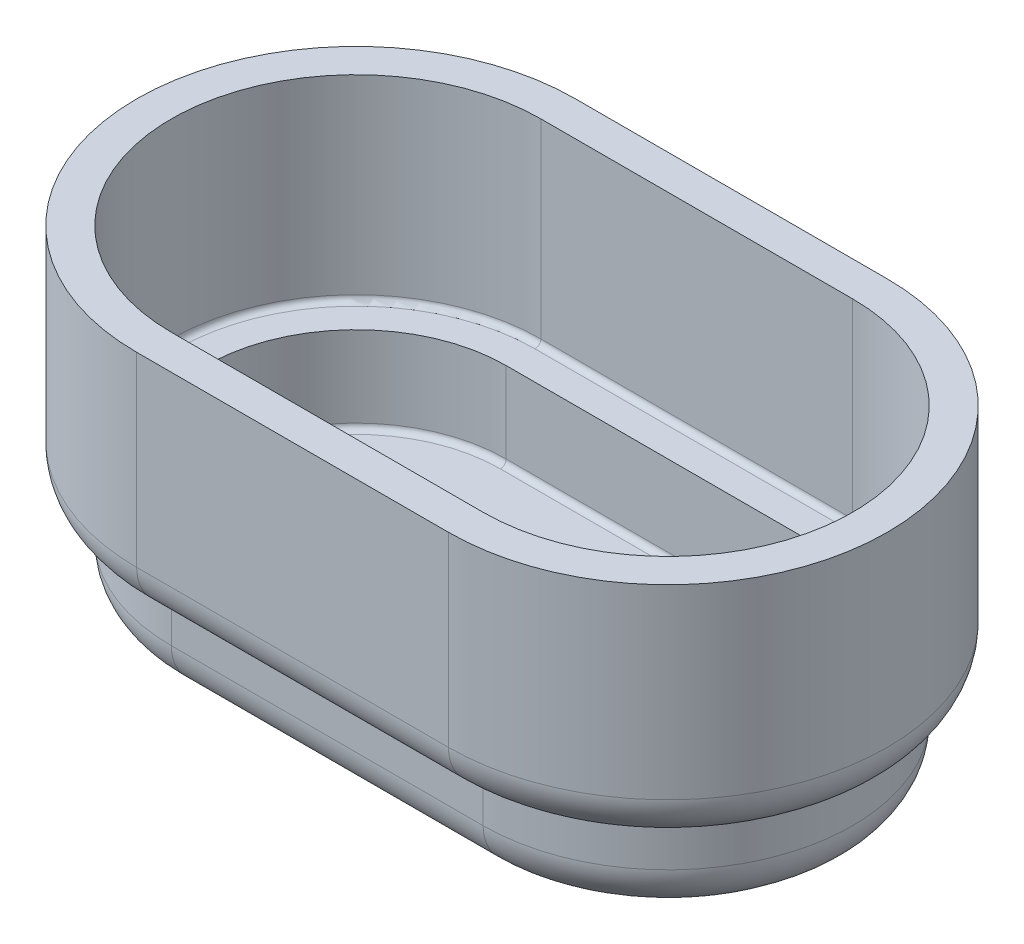
ISO-10303-21;
HEADER;
FILE_DESCRIPTION(('STEP AP214'),'2;1');
FILE_NAME('part.step','',(''),(''),'','','');
FILE_SCHEMA(('AUTOMOTIVE_DESIGN { 1 0 10303 214 1 1 1 1 }'));
ENDSEC;
DATA;
#1=APPLICATION_CONTEXT('core data for automotive mechanical design processes');
#2=APPLICATION_PROTOCOL_DEFINITION('international standard','automotive_design',2000,#1);
#3=PRODUCT_CONTEXT('',#1,'mechanical');
#4=PRODUCT('Part','Part','',(#3));
#5=PRODUCT_RELATED_PRODUCT_CATEGORY('part','',(#4));
#6=PRODUCT_DEFINITION_FORMATION('','',#4);
#7=PRODUCT_DEFINITION_CONTEXT('part definition',#1,'design');
#8=PRODUCT_DEFINITION('design','',#6,#7);
#9=PRODUCT_DEFINITION_SHAPE('','',#8);
#10=(LENGTH_UNIT() NAMED_UNIT(*) SI_UNIT(.MILLI.,.METRE.));
#11=(NAMED_UNIT(*) PLANE_ANGLE_UNIT() SI_UNIT($,.RADIAN.));
#12=(NAMED_UNIT(*) SI_UNIT($,.STERADIAN.) SOLID_ANGLE_UNIT());
#13=UNCERTAINTY_MEASURE_WITH_UNIT(LENGTH_MEASURE(1.E-05),#10,'distance_accuracy_value','');
#14=(GEOMETRIC_REPRESENTATION_CONTEXT(3) GLOBAL_UNCERTAINTY_ASSIGNED_CONTEXT((#13)) GLOBAL_UNIT_ASSIGNED_CONTEXT((#10,
#11,#12)) REPRESENTATION_CONTEXT('',''));
#15=CARTESIAN_POINT('',(0.,0.,0.));
#16=DIRECTION('',(0.,0.,1.));
#17=DIRECTION('',(1.,0.,0.));
#18=AXIS2_PLACEMENT_3D('',#15,#16,#17);
#19=CARTESIAN_POINT('',(-23.342939481268,-40.,0.));
#20=DIRECTION('',(0.,1.,0.));
#21=DIRECTION('',(0.,0.,1.));
#22=AXIS2_PLACEMENT_3D('',#19,#20,#21);
#23=CYLINDRICAL_SURFACE('',#22,38.);
#24=DIRECTION('',(0.,1.,0.));
#25=VECTOR('',#24,1.);
#26=CARTESIAN_POINT('',(-23.342939481268,-40.,-38.));
#27=LINE('',#26,#25);
#28=CARTESIAN_POINT('',(-23.342939481268,-32.2540333075852,-38.));
#29=VERTEX_POINT('',#28);
#30=CARTESIAN_POINT('',(-23.342939481268,0.,-38.));
#31=VERTEX_POINT('',#30);
#32=EDGE_CURVE('E270',#29,#31,#27,.T.);
#33=ORIENTED_EDGE('',*,*,#32,.F.);
#34=CARTESIAN_POINT('',(-23.342939481268,-32.2540333075852,0.));
#35=DIRECTION('',(0.,-1.,0.));
#36=DIRECTION('',(0.,0.,-1.));
#37=AXIS2_PLACEMENT_3D('',#34,#35,#36);
#38=CIRCLE('',#37,38.);
#39=CARTESIAN_POINT('',(-23.342939481268,-32.2540333075852,38.));
#40=VERTEX_POINT('',#39);
#41=EDGE_CURVE('E280',#29,#40,#38,.F.);
#42=ORIENTED_EDGE('',*,*,#41,.T.);
#43=DIRECTION('',(0.,1.,0.));
#44=VECTOR('',#43,1.);
#45=CARTESIAN_POINT('',(-23.342939481268,-40.,38.));
#46=LINE('',#45,#44);
#47=CARTESIAN_POINT('',(-23.342939481268,0.,38.));
#48=VERTEX_POINT('',#47);
#49=EDGE_CURVE('E269',#40,#48,#46,.T.);
#50=ORIENTED_EDGE('',*,*,#49,.T.);
#51=CARTESIAN_POINT('',(-23.342939481268,0.,0.));
#52=DIRECTION('',(0.,1.,0.));
#53=DIRECTION('',(0.,0.,1.));
#54=AXIS2_PLACEMENT_3D('',#51,#52,#53);
#55=CIRCLE('',#54,38.);
#56=EDGE_CURVE('E257',#31,#48,#55,.T.);
#57=ORIENTED_EDGE('',*,*,#56,.F.);
#58=EDGE_LOOP('',(#33,#42,#50,#57));
#59=FACE_BOUND('',#58,.T.);
#60=ADVANCED_FACE('F32',(#59),#23,.T.);
#61=CARTESIAN_POINT('',(-23.342939481268,-40.,-38.));
#62=DIRECTION('',(0.,0.,1.));
#63=DIRECTION('',(1.,0.,0.));
#64=AXIS2_PLACEMENT_3D('',#61,#62,#63);
#65=PLANE('',#64);
#66=DIRECTION('',(0.,1.,0.));
#67=VECTOR('',#66,1.);
#68=CARTESIAN_POINT('',(30.657060518732,-40.,-38.));
#69=LINE('',#68,#67);
#70=CARTESIAN_POINT('',(30.657060518732,-32.2540333075852,-38.));
#71=VERTEX_POINT('',#70);
#72=CARTESIAN_POINT('',(30.657060518732,0.,-38.));
#73=VERTEX_POINT('',#72);
#74=EDGE_CURVE('E273',#71,#73,#69,.T.);
#75=ORIENTED_EDGE('',*,*,#74,.F.);
#76=DIRECTION('',(1.,0.,0.));
#77=VECTOR('',#76,1.);
#78=CARTESIAN_POINT('',(-23.342939481268,-32.2540333075852,-38.));
#79=LINE('',#78,#77);
#80=EDGE_CURVE('E282',#71,#29,#79,.F.);
#81=ORIENTED_EDGE('',*,*,#80,.T.);
#82=ORIENTED_EDGE('',*,*,#32,.T.);
#83=DIRECTION('',(1.,0.,0.));
#84=VECTOR('',#83,1.);
#85=CARTESIAN_POINT('',(-23.342939481268,0.,-38.));
#86=LINE('',#85,#84);
#87=EDGE_CURVE('E266',#31,#73,#86,.T.);
#88=ORIENTED_EDGE('',*,*,#87,.T.);
#89=EDGE_LOOP('',(#75,#81,#82,#88));
#90=FACE_BOUND('',#89,.T.);
#91=ADVANCED_FACE('F409',(#90),#65,.F.);
#92=CARTESIAN_POINT('',(30.657060518732,-40.,0.));
#93=DIRECTION('',(0.,1.,0.));
#94=DIRECTION('',(0.,0.,1.));
#95=AXIS2_PLACEMENT_3D('',#92,#93,#94);
#96=CYLINDRICAL_SURFACE('',#95,38.);
#97=DIRECTION('',(0.,1.,0.));
#98=VECTOR('',#97,1.);
#99=CARTESIAN_POINT('',(30.657060518732,-40.,38.));
#100=LINE('',#99,#98);
#101=CARTESIAN_POINT('',(30.657060518732,-32.2540333075852,38.));
#102=VERTEX_POINT('',#101);
#103=CARTESIAN_POINT('',(30.657060518732,0.,38.));
#104=VERTEX_POINT('',#103);
#105=EDGE_CURVE('E275',#102,#104,#100,.T.);
#106=ORIENTED_EDGE('',*,*,#105,.F.);
#107=CARTESIAN_POINT('',(30.657060518732,-32.2540333075852,0.));
#108=DIRECTION('',(0.,-1.,0.));
#109=DIRECTION('',(0.,0.,-1.));
#110=AXIS2_PLACEMENT_3D('',#107,#108,#109);
#111=CIRCLE('',#110,38.);
#112=EDGE_CURVE('E300',#102,#71,#111,.F.);
#113=ORIENTED_EDGE('',*,*,#112,.T.);
#114=ORIENTED_EDGE('',*,*,#74,.T.);
#115=CARTESIAN_POINT('',(30.657060518732,0.,0.));
#116=DIRECTION('',(0.,1.,0.));
#117=DIRECTION('',(0.,0.,1.));
#118=AXIS2_PLACEMENT_3D('',#115,#116,#117);
#119=CIRCLE('',#118,38.);
#120=EDGE_CURVE('E263',#104,#73,#119,.T.);
#121=ORIENTED_EDGE('',*,*,#120,.F.);
#122=EDGE_LOOP('',(#106,#113,#114,#121));
#123=FACE_BOUND('',#122,.T.);
#124=ADVANCED_FACE('F415',(#123),#96,.T.);
#125=CARTESIAN_POINT('',(-23.342939481268,-40.,38.));
#126=DIRECTION('',(0.,0.,1.));
#127=DIRECTION('',(1.,0.,0.));
#128=AXIS2_PLACEMENT_3D('',#125,#126,#127);
#129=PLANE('',#128);
#130=ORIENTED_EDGE('',*,*,#49,.F.);
#131=DIRECTION('',(-1.,0.,0.));
#132=VECTOR('',#131,1.);
#133=CARTESIAN_POINT('',(30.657060518732,-32.2540333075852,38.));
#134=LINE('',#133,#132);
#135=EDGE_CURVE('E272',#40,#102,#134,.F.);
#136=ORIENTED_EDGE('',*,*,#135,.T.);
#137=ORIENTED_EDGE('',*,*,#105,.T.);
#138=DIRECTION('',(1.,0.,0.));
#139=VECTOR('',#138,1.);
#140=CARTESIAN_POINT('',(-23.342939481268,0.,38.));
#141=LINE('',#140,#139);
#142=EDGE_CURVE('E260',#48,#104,#141,.T.);
#143=ORIENTED_EDGE('',*,*,#142,.F.);
#144=EDGE_LOOP('',(#130,#136,#137,#143));
#145=FACE_BOUND('',#144,.T.);
#146=ADVANCED_FACE('F421',(#145),#129,.T.);
#147=CARTESIAN_POINT('',(-23.342939481268,0.,0.));
#148=DIRECTION('',(0.,1.,0.));
#149=DIRECTION('',(0.,0.,1.));
#150=AXIS2_PLACEMENT_3D('',#147,#148,#149);
#151=PLANE('',#150);
#152=CARTESIAN_POINT('',(-23.342939481268,0.,0.));
#153=DIRECTION('',(0.,1.,0.));
#154=DIRECTION('',(0.,0.,1.));
#155=AXIS2_PLACEMENT_3D('',#152,#153,#154);
#156=CIRCLE('',#155,32.);
#157=CARTESIAN_POINT('',(-23.342939481268,0.,-32.));
#158=VERTEX_POINT('',#157);
#159=CARTESIAN_POINT('',(-23.342939481268,0.,32.));
#160=VERTEX_POINT('',#159);
#161=EDGE_CURVE('E202',#158,#160,#156,.T.);
#162=ORIENTED_EDGE('',*,*,#161,.F.);
#163=DIRECTION('',(1.,0.,0.));
#164=VECTOR('',#163,1.);
#165=CARTESIAN_POINT('',(-23.342939481268,0.,-32.));
#166=LINE('',#165,#164);
#167=CARTESIAN_POINT('',(30.657060518732,0.,-32.));
#168=VERTEX_POINT('',#167);
#169=EDGE_CURVE('E218',#158,#168,#166,.T.);
#170=ORIENTED_EDGE('',*,*,#169,.T.);
#171=CARTESIAN_POINT('',(30.657060518732,0.,0.));
#172=DIRECTION('',(0.,1.,0.));
#173=DIRECTION('',(0.,0.,1.));
#174=AXIS2_PLACEMENT_3D('',#171,#172,#173);
#175=CIRCLE('',#174,32.);
#176=CARTESIAN_POINT('',(30.657060518732,0.,32.));
#177=VERTEX_POINT('',#176);
#178=EDGE_CURVE('E232',#177,#168,#175,.T.);
#179=ORIENTED_EDGE('',*,*,#178,.F.);
#180=DIRECTION('',(1.,0.,0.));
#181=VECTOR('',#180,1.);
#182=CARTESIAN_POINT('',(-23.342939481268,0.,32.));
#183=LINE('',#182,#181);
#184=EDGE_CURVE('E229',#160,#177,#183,.T.);
#185=ORIENTED_EDGE('',*,*,#184,.F.);
#186=EDGE_LOOP('',(#162,#170,#179,#185));
#187=FACE_BOUND('',#186,.T.);
#188=ORIENTED_EDGE('',*,*,#56,.T.);
#189=ORIENTED_EDGE('',*,*,#142,.T.);
#190=ORIENTED_EDGE('',*,*,#120,.T.);
#191=ORIENTED_EDGE('',*,*,#87,.F.);
#192=EDGE_LOOP('',(#188,#189,#190,#191));
#193=FACE_BOUND('',#192,.T.);
#194=ADVANCED_FACE('F633',(#187,#193),#151,.T.);
#195=CARTESIAN_POINT('',(-23.342939481268,-55.,-32.));
#196=DIRECTION('',(0.,0.,1.));
#197=DIRECTION('',(1.,0.,0.));
#198=AXIS2_PLACEMENT_3D('',#195,#196,#197);
#199=PLANE('',#198);
#200=DIRECTION('',(0.,1.,0.));
#201=VECTOR('',#200,1.);
#202=CARTESIAN_POINT('',(30.657060518732,-55.,-32.));
#203=LINE('',#202,#201);
#204=CARTESIAN_POINT('',(30.657060518732,-47.,-32.));
#205=VERTEX_POINT('',#204);
#206=CARTESIAN_POINT('',(30.657060518732,-40.,-32.));
#207=VERTEX_POINT('',#206);
#208=EDGE_CURVE('E243',#205,#207,#203,.T.);
#209=ORIENTED_EDGE('',*,*,#208,.F.);
#210=DIRECTION('',(1.,0.,0.));
#211=VECTOR('',#210,1.);
#212=CARTESIAN_POINT('',(-23.342939481268,-47.,-32.));
#213=LINE('',#212,#211);
#214=CARTESIAN_POINT('',(-23.342939481268,-47.,-32.));
#215=VERTEX_POINT('',#214);
#216=EDGE_CURVE('E298',#205,#215,#213,.F.);
#217=ORIENTED_EDGE('',*,*,#216,.T.);
#218=DIRECTION('',(0.,1.,0.));
#219=VECTOR('',#218,1.);
#220=CARTESIAN_POINT('',(-23.342939481268,-55.,-32.));
#221=LINE('',#220,#219);
#222=CARTESIAN_POINT('',(-23.342939481268,-40.,-32.));
#223=VERTEX_POINT('',#222);
#224=EDGE_CURVE('E213',#215,#223,#221,.T.);
#225=ORIENTED_EDGE('',*,*,#224,.T.);
#226=DIRECTION('',(1.,0.,0.));
#227=VECTOR('',#226,1.);
#228=CARTESIAN_POINT('',(-23.342939481268,-40.,-32.));
#229=LINE('',#228,#227);
#230=EDGE_CURVE('E254',#223,#207,#229,.T.);
#231=ORIENTED_EDGE('',*,*,#230,.T.);
#232=EDGE_LOOP('',(#209,#217,#225,#231));
#233=FACE_BOUND('',#232,.T.);
#234=ADVANCED_FACE('F624',(#233),#199,.F.);
#235=CARTESIAN_POINT('',(30.657060518732,-55.,0.));
#236=DIRECTION('',(0.,1.,0.));
#237=DIRECTION('',(0.,0.,1.));
#238=AXIS2_PLACEMENT_3D('',#235,#236,#237);
#239=CYLINDRICAL_SURFACE('',#238,32.);
#240=DIRECTION('',(0.,1.,0.));
#241=VECTOR('',#240,1.);
#242=CARTESIAN_POINT('',(30.657060518732,-55.,32.));
#243=LINE('',#242,#241);
#244=CARTESIAN_POINT('',(30.657060518732,-47.,32.));
#245=VERTEX_POINT('',#244);
#246=CARTESIAN_POINT('',(30.657060518732,-40.,32.));
#247=VERTEX_POINT('',#246);
#248=EDGE_CURVE('E241',#245,#247,#243,.T.);
#249=ORIENTED_EDGE('',*,*,#248,.F.);
#250=CARTESIAN_POINT('',(30.657060518732,-47.,0.));
#251=DIRECTION('',(0.,1.,0.));
#252=DIRECTION('',(0.,0.,1.));
#253=AXIS2_PLACEMENT_3D('',#250,#251,#252);
#254=CIRCLE('',#253,32.);
#255=EDGE_CURVE('E302',#245,#205,#254,.T.);
#256=ORIENTED_EDGE('',*,*,#255,.T.);
#257=ORIENTED_EDGE('',*,*,#208,.T.);
#258=CARTESIAN_POINT('',(30.657060518732,-40.,0.));
#259=DIRECTION('',(0.,1.,0.));
#260=DIRECTION('',(0.,0.,1.));
#261=AXIS2_PLACEMENT_3D('',#258,#259,#260);
#262=CIRCLE('',#261,32.);
#263=EDGE_CURVE('E251',#247,#207,#262,.T.);
#264=ORIENTED_EDGE('',*,*,#263,.F.);
#265=EDGE_LOOP('',(#249,#256,#257,#264));
#266=FACE_BOUND('',#265,.T.);
#267=ADVANCED_FACE('F615',(#266),#239,.T.);
#268=CARTESIAN_POINT('',(-23.342939481268,-55.,32.));
#269=DIRECTION('',(0.,0.,1.));
#270=DIRECTION('',(1.,0.,0.));
#271=AXIS2_PLACEMENT_3D('',#268,#269,#270);
#272=PLANE('',#271);
#273=DIRECTION('',(0.,1.,0.));
#274=VECTOR('',#273,1.);
#275=CARTESIAN_POINT('',(-23.342939481268,-55.,32.));
#276=LINE('',#275,#274);
#277=CARTESIAN_POINT('',(-23.342939481268,-47.,32.));
#278=VERTEX_POINT('',#277);
#279=CARTESIAN_POINT('',(-23.342939481268,-40.,32.));
#280=VERTEX_POINT('',#279);
#281=EDGE_CURVE('E238',#278,#280,#276,.T.);
#282=ORIENTED_EDGE('',*,*,#281,.F.);
#283=DIRECTION('',(1.,0.,0.));
#284=VECTOR('',#283,1.);
#285=CARTESIAN_POINT('',(30.657060518732,-47.,32.));
#286=LINE('',#285,#284);
#287=EDGE_CURVE('E284',#278,#245,#286,.T.);
#288=ORIENTED_EDGE('',*,*,#287,.T.);
#289=ORIENTED_EDGE('',*,*,#248,.T.);
#290=DIRECTION('',(1.,0.,0.));
#291=VECTOR('',#290,1.);
#292=CARTESIAN_POINT('',(-23.342939481268,-40.,32.));
#293=LINE('',#292,#291);
#294=EDGE_CURVE('E248',#280,#247,#293,.T.);
#295=ORIENTED_EDGE('',*,*,#294,.F.);
#296=EDGE_LOOP('',(#282,#288,#289,#295));
#297=FACE_BOUND('',#296,.T.);
#298=ADVANCED_FACE('F606',(#297),#272,.T.);
#299=CARTESIAN_POINT('',(-23.342939481268,-55.,0.));
#300=DIRECTION('',(0.,1.,0.));
#301=DIRECTION('',(0.,0.,1.));
#302=AXIS2_PLACEMENT_3D('',#299,#300,#301);
#303=CYLINDRICAL_SURFACE('',#302,32.);
#304=ORIENTED_EDGE('',*,*,#224,.F.);
#305=CARTESIAN_POINT('',(-23.342939481268,-47.,0.));
#306=DIRECTION('',(0.,1.,0.));
#307=DIRECTION('',(0.,0.,1.));
#308=AXIS2_PLACEMENT_3D('',#305,#306,#307);
#309=CIRCLE('',#308,32.);
#310=EDGE_CURVE('E296',#215,#278,#309,.T.);
#311=ORIENTED_EDGE('',*,*,#310,.T.);
#312=ORIENTED_EDGE('',*,*,#281,.T.);
#313=CARTESIAN_POINT('',(-23.342939481268,-40.,0.));
#314=DIRECTION('',(0.,1.,0.));
#315=DIRECTION('',(0.,0.,1.));
#316=AXIS2_PLACEMENT_3D('',#313,#314,#315);
#317=CIRCLE('',#316,32.);
#318=EDGE_CURVE('E245',#223,#280,#317,.T.);
#319=ORIENTED_EDGE('',*,*,#318,.F.);
#320=EDGE_LOOP('',(#304,#311,#312,#319));
#321=FACE_BOUND('',#320,.T.);
#322=ADVANCED_FACE('F405',(#321),#303,.T.);
#323=CARTESIAN_POINT('',(30.657060518732,-55.,0.));
#324=DIRECTION('',(0.,1.,0.));
#325=DIRECTION('',(0.,0.,1.));
#326=AXIS2_PLACEMENT_3D('',#323,#324,#325);
#327=PLANE('',#326);
#328=CARTESIAN_POINT('',(30.657060518732,-55.,0.));
#329=DIRECTION('',(0.,1.,0.));
#330=DIRECTION('',(0.,0.,1.));
#331=AXIS2_PLACEMENT_3D('',#328,#329,#330);
#332=CIRCLE('',#331,24.);
#333=CARTESIAN_POINT('',(30.657060518732,-55.,-24.));
#334=VERTEX_POINT('',#333);
#335=CARTESIAN_POINT('',(30.657060518732,-55.,24.));
#336=VERTEX_POINT('',#335);
#337=EDGE_CURVE('E287',#334,#336,#332,.F.);
#338=ORIENTED_EDGE('',*,*,#337,.T.);
#339=DIRECTION('',(1.,0.,0.));
#340=VECTOR('',#339,1.);
#341=CARTESIAN_POINT('',(-23.342939481268,-55.,24.));
#342=LINE('',#341,#340);
#343=CARTESIAN_POINT('',(-23.342939481268,-55.,24.));
#344=VERTEX_POINT('',#343);
#345=EDGE_CURVE('E293',#336,#344,#342,.F.);
#346=ORIENTED_EDGE('',*,*,#345,.T.);
#347=CARTESIAN_POINT('',(-23.342939481268,-55.,0.));
#348=DIRECTION('',(0.,1.,0.));
#349=DIRECTION('',(0.,0.,1.));
#350=AXIS2_PLACEMENT_3D('',#347,#348,#349);
#351=CIRCLE('',#350,24.);
#352=CARTESIAN_POINT('',(-23.342939481268,-55.,-24.));
#353=VERTEX_POINT('',#352);
#354=EDGE_CURVE('E291',#344,#353,#351,.F.);
#355=ORIENTED_EDGE('',*,*,#354,.T.);
#356=DIRECTION('',(1.,0.,0.));
#357=VECTOR('',#356,1.);
#358=CARTESIAN_POINT('',(30.657060518732,-55.,-24.));
#359=LINE('',#358,#357);
#360=EDGE_CURVE('E289',#353,#334,#359,.T.);
#361=ORIENTED_EDGE('',*,*,#360,.T.);
#362=EDGE_LOOP('',(#338,#346,#355,#361));
#363=FACE_BOUND('',#362,.T.);
#364=ADVANCED_FACE('F397',(#363),#327,.F.);
#365=CARTESIAN_POINT('',(-23.342939481268,-34.,0.));
#366=DIRECTION('',(0.,1.,0.));
#367=DIRECTION('',(0.,0.,1.));
#368=AXIS2_PLACEMENT_3D('',#365,#366,#367);
#369=PLANE('',#368);
#370=DIRECTION('',(1.,0.,0.));
#371=VECTOR('',#370,1.);
#372=CARTESIAN_POINT('',(-23.342939481268,-34.,-31.));
#373=LINE('',#372,#371);
#374=CARTESIAN_POINT('',(30.657060518732,-34.,-31.));
#375=VERTEX_POINT('',#374);
#376=CARTESIAN_POINT('',(-23.342939481268,-34.,-31.));
#377=VERTEX_POINT('',#376);
#378=EDGE_CURVE('E340',#375,#377,#373,.F.);
#379=ORIENTED_EDGE('',*,*,#378,.T.);
#380=CARTESIAN_POINT('',(-23.342939481268,-34.,0.));
#381=DIRECTION('',(0.,1.,0.));
#382=DIRECTION('',(0.,0.,1.));
#383=AXIS2_PLACEMENT_3D('',#380,#381,#382);
#384=CIRCLE('',#383,31.);
#385=CARTESIAN_POINT('',(-23.342939481268,-34.,31.));
#386=VERTEX_POINT('',#385);
#387=EDGE_CURVE('E346',#377,#386,#384,.T.);
#388=ORIENTED_EDGE('',*,*,#387,.T.);
#389=DIRECTION('',(1.,0.,0.));
#390=VECTOR('',#389,1.);
#391=CARTESIAN_POINT('',(-23.342939481268,-34.,31.));
#392=LINE('',#391,#390);
#393=CARTESIAN_POINT('',(30.657060518732,-34.,31.));
#394=VERTEX_POINT('',#393);
#395=EDGE_CURVE('E344',#386,#394,#392,.T.);
#396=ORIENTED_EDGE('',*,*,#395,.T.);
#397=CARTESIAN_POINT('',(30.657060518732,-34.,0.));
#398=DIRECTION('',(0.,1.,0.));
#399=DIRECTION('',(0.,0.,1.));
#400=AXIS2_PLACEMENT_3D('',#397,#398,#399);
#401=CIRCLE('',#400,31.);
#402=EDGE_CURVE('E342',#394,#375,#401,.T.);
#403=ORIENTED_EDGE('',*,*,#402,.T.);
#404=EDGE_LOOP('',(#379,#388,#396,#403));
#405=FACE_BOUND('',#404,.T.);
#406=DIRECTION('',(1.,0.,0.));
#407=VECTOR('',#406,1.);
#408=CARTESIAN_POINT('',(-23.342939481268,-34.,-26.));
#409=LINE('',#408,#407);
#410=CARTESIAN_POINT('',(-23.342939481268,-34.,-26.));
#411=VERTEX_POINT('',#410);
#412=CARTESIAN_POINT('',(30.657060518732,-34.,-26.));
#413=VERTEX_POINT('',#412);
#414=EDGE_CURVE('E186',#411,#413,#409,.T.);
#415=ORIENTED_EDGE('',*,*,#414,.T.);
#416=CARTESIAN_POINT('',(30.657060518732,-34.,0.));
#417=DIRECTION('',(0.,1.,0.));
#418=DIRECTION('',(0.,0.,1.));
#419=AXIS2_PLACEMENT_3D('',#416,#417,#418);
#420=CIRCLE('',#419,26.);
#421=CARTESIAN_POINT('',(30.657060518732,-34.,26.));
#422=VERTEX_POINT('',#421);
#423=EDGE_CURVE('E199',#422,#413,#420,.T.);
#424=ORIENTED_EDGE('',*,*,#423,.F.);
#425=DIRECTION('',(1.,0.,0.));
#426=VECTOR('',#425,1.);
#427=CARTESIAN_POINT('',(-23.342939481268,-34.,26.));
#428=LINE('',#427,#426);
#429=CARTESIAN_POINT('',(-23.342939481268,-34.,26.));
#430=VERTEX_POINT('',#429);
#431=EDGE_CURVE('E206',#430,#422,#428,.T.);
#432=ORIENTED_EDGE('',*,*,#431,.F.);
#433=CARTESIAN_POINT('',(-23.342939481268,-34.,0.));
#434=DIRECTION('',(0.,1.,0.));
#435=DIRECTION('',(0.,0.,1.));
#436=AXIS2_PLACEMENT_3D('',#433,#434,#435);
#437=CIRCLE('',#436,26.);
#438=EDGE_CURVE('E191',#411,#430,#437,.T.);
#439=ORIENTED_EDGE('',*,*,#438,.F.);
#440=EDGE_LOOP('',(#415,#424,#432,#439));
#441=FACE_BOUND('',#440,.T.);
#442=ADVANCED_FACE('F197',(#405,#441),#369,.T.);
#443=CARTESIAN_POINT('',(-23.342939481268,-40.,0.));
#444=DIRECTION('',(0.,1.,0.));
#445=DIRECTION('',(0.,0.,1.));
#446=AXIS2_PLACEMENT_3D('',#443,#444,#445);
#447=CYLINDRICAL_SURFACE('',#446,32.);
#448=DIRECTION('',(0.,1.,0.));
#449=VECTOR('',#448,1.);
#450=CARTESIAN_POINT('',(-23.342939481268,-40.,32.));
#451=LINE('',#450,#449);
#452=CARTESIAN_POINT('',(-23.342939481268,-33.,32.));
#453=VERTEX_POINT('',#452);
#454=EDGE_CURVE('E215',#453,#160,#451,.T.);
#455=ORIENTED_EDGE('',*,*,#454,.F.);
#456=CARTESIAN_POINT('',(-23.342939481268,-33.,0.));
#457=DIRECTION('',(0.,1.,0.));
#458=DIRECTION('',(0.,0.,1.));
#459=AXIS2_PLACEMENT_3D('',#456,#457,#458);
#460=CIRCLE('',#459,32.);
#461=CARTESIAN_POINT('',(-23.342939481268,-33.,-32.));
#462=VERTEX_POINT('',#461);
#463=EDGE_CURVE('E349',#453,#462,#460,.F.);
#464=ORIENTED_EDGE('',*,*,#463,.T.);
#465=DIRECTION('',(0.,1.,0.));
#466=VECTOR('',#465,1.);
#467=CARTESIAN_POINT('',(-23.342939481268,-40.,-32.));
#468=LINE('',#467,#466);
#469=EDGE_CURVE('E211',#462,#158,#468,.T.);
#470=ORIENTED_EDGE('',*,*,#469,.T.);
#471=ORIENTED_EDGE('',*,*,#161,.T.);
#472=EDGE_LOOP('',(#455,#464,#470,#471));
#473=FACE_BOUND('',#472,.T.);
#474=ADVANCED_FACE('F389',(#473),#447,.F.);
#475=CARTESIAN_POINT('',(-23.342939481268,-40.,-32.));
#476=DIRECTION('',(0.,0.,1.));
#477=DIRECTION('',(1.,0.,0.));
#478=AXIS2_PLACEMENT_3D('',#475,#476,#477);
#479=PLANE('',#478);
#480=ORIENTED_EDGE('',*,*,#469,.F.);
#481=DIRECTION('',(1.,0.,0.));
#482=VECTOR('',#481,1.);
#483=CARTESIAN_POINT('',(30.657060518732,-33.,-32.));
#484=LINE('',#483,#482);
#485=CARTESIAN_POINT('',(30.657060518732,-33.,-32.));
#486=VERTEX_POINT('',#485);
#487=EDGE_CURVE('E11',#462,#486,#484,.T.);
#488=ORIENTED_EDGE('',*,*,#487,.T.);
#489=DIRECTION('',(0.,1.,0.));
#490=VECTOR('',#489,1.);
#491=CARTESIAN_POINT('',(30.657060518732,-40.,-32.));
#492=LINE('',#491,#490);
#493=EDGE_CURVE('E214',#486,#168,#492,.T.);
#494=ORIENTED_EDGE('',*,*,#493,.T.);
#495=ORIENTED_EDGE('',*,*,#169,.F.);
#496=EDGE_LOOP('',(#480,#488,#494,#495));
#497=FACE_BOUND('',#496,.T.);
#498=ADVANCED_FACE('F403',(#497),#479,.T.);
#499=CARTESIAN_POINT('',(30.657060518732,-40.,0.));
#500=DIRECTION('',(0.,1.,0.));
#501=DIRECTION('',(0.,0.,1.));
#502=AXIS2_PLACEMENT_3D('',#499,#500,#501);
#503=CYLINDRICAL_SURFACE('',#502,32.);
#504=ORIENTED_EDGE('',*,*,#493,.F.);
#505=CARTESIAN_POINT('',(30.657060518732,-33.,0.));
#506=DIRECTION('',(0.,1.,0.));
#507=DIRECTION('',(0.,0.,1.));
#508=AXIS2_PLACEMENT_3D('',#505,#506,#507);
#509=CIRCLE('',#508,32.);
#510=CARTESIAN_POINT('',(30.657060518732,-33.,32.));
#511=VERTEX_POINT('',#510);
#512=EDGE_CURVE('E54',#486,#511,#509,.F.);
#513=ORIENTED_EDGE('',*,*,#512,.T.);
#514=DIRECTION('',(0.,1.,0.));
#515=VECTOR('',#514,1.);
#516=CARTESIAN_POINT('',(30.657060518732,-40.,32.));
#517=LINE('',#516,#515);
#518=EDGE_CURVE('E217',#511,#177,#517,.T.);
#519=ORIENTED_EDGE('',*,*,#518,.T.);
#520=ORIENTED_EDGE('',*,*,#178,.T.);
#521=EDGE_LOOP('',(#504,#513,#519,#520));
#522=FACE_BOUND('',#521,.T.);
#523=ADVANCED_FACE('F571',(#522),#503,.F.);
#524=CARTESIAN_POINT('',(-23.342939481268,-40.,32.));
#525=DIRECTION('',(0.,0.,1.));
#526=DIRECTION('',(1.,0.,0.));
#527=AXIS2_PLACEMENT_3D('',#524,#525,#526);
#528=PLANE('',#527);
#529=ORIENTED_EDGE('',*,*,#518,.F.);
#530=DIRECTION('',(1.,0.,0.));
#531=VECTOR('',#530,1.);
#532=CARTESIAN_POINT('',(-23.342939481268,-33.,32.));
#533=LINE('',#532,#531);
#534=EDGE_CURVE('E352',#511,#453,#533,.F.);
#535=ORIENTED_EDGE('',*,*,#534,.T.);
#536=ORIENTED_EDGE('',*,*,#454,.T.);
#537=ORIENTED_EDGE('',*,*,#184,.T.);
#538=EDGE_LOOP('',(#529,#535,#536,#537));
#539=FACE_BOUND('',#538,.T.);
#540=ADVANCED_FACE('F386',(#539),#528,.F.);
#541=CARTESIAN_POINT('',(-23.342939481268,-55.,-26.));
#542=DIRECTION('',(0.,0.,1.));
#543=DIRECTION('',(1.,0.,0.));
#544=AXIS2_PLACEMENT_3D('',#541,#542,#543);
#545=PLANE('',#544);
#546=DIRECTION('',(0.,1.,0.));
#547=VECTOR('',#546,1.);
#548=CARTESIAN_POINT('',(-23.342939481268,-55.,-26.));
#549=LINE('',#548,#547);
#550=CARTESIAN_POINT('',(-23.342939481268,-48.,-26.));
#551=VERTEX_POINT('',#550);
#552=EDGE_CURVE('E221',#551,#411,#549,.T.);
#553=ORIENTED_EDGE('',*,*,#552,.F.);
#554=DIRECTION('',(1.,0.,0.));
#555=VECTOR('',#554,1.);
#556=CARTESIAN_POINT('',(30.657060518732,-48.,-26.));
#557=LINE('',#556,#555);
#558=CARTESIAN_POINT('',(30.657060518732,-48.,-26.));
#559=VERTEX_POINT('',#558);
#560=EDGE_CURVE('E41',#551,#559,#557,.T.);
#561=ORIENTED_EDGE('',*,*,#560,.T.);
#562=DIRECTION('',(0.,1.,0.));
#563=VECTOR('',#562,1.);
#564=CARTESIAN_POINT('',(30.657060518732,-55.,-26.));
#565=LINE('',#564,#563);
#566=EDGE_CURVE('E182',#559,#413,#565,.T.);
#567=ORIENTED_EDGE('',*,*,#566,.T.);
#568=ORIENTED_EDGE('',*,*,#414,.F.);
#569=EDGE_LOOP('',(#553,#561,#567,#568));
#570=FACE_BOUND('',#569,.T.);
#571=ADVANCED_FACE('F185',(#570),#545,.T.);
#572=CARTESIAN_POINT('',(30.657060518732,-55.,0.));
#573=DIRECTION('',(0.,1.,0.));
#574=DIRECTION('',(0.,0.,1.));
#575=AXIS2_PLACEMENT_3D('',#572,#573,#574);
#576=CYLINDRICAL_SURFACE('',#575,26.);
#577=ORIENTED_EDGE('',*,*,#566,.F.);
#578=CARTESIAN_POINT('',(30.657060518732,-48.,0.));
#579=DIRECTION('',(0.,1.,0.));
#580=DIRECTION('',(0.,0.,1.));
#581=AXIS2_PLACEMENT_3D('',#578,#579,#580);
#582=CIRCLE('',#581,26.);
#583=CARTESIAN_POINT('',(30.657060518732,-48.,26.));
#584=VERTEX_POINT('',#583);
#585=EDGE_CURVE('E338',#559,#584,#582,.F.);
#586=ORIENTED_EDGE('',*,*,#585,.T.);
#587=DIRECTION('',(0.,1.,0.));
#588=VECTOR('',#587,1.);
#589=CARTESIAN_POINT('',(30.657060518732,-55.,26.));
#590=LINE('',#589,#588);
#591=EDGE_CURVE('E192',#584,#422,#590,.T.);
#592=ORIENTED_EDGE('',*,*,#591,.T.);
#593=ORIENTED_EDGE('',*,*,#423,.T.);
#594=EDGE_LOOP('',(#577,#586,#592,#593));
#595=FACE_BOUND('',#594,.T.);
#596=ADVANCED_FACE('F204',(#595),#576,.F.);
#597=CARTESIAN_POINT('',(-23.342939481268,-55.,26.));
#598=DIRECTION('',(0.,0.,1.));
#599=DIRECTION('',(1.,0.,0.));
#600=AXIS2_PLACEMENT_3D('',#597,#598,#599);
#601=PLANE('',#600);
#602=ORIENTED_EDGE('',*,*,#591,.F.);
#603=DIRECTION('',(1.,0.,0.));
#604=VECTOR('',#603,1.);
#605=CARTESIAN_POINT('',(-23.342939481268,-48.,26.));
#606=LINE('',#605,#604);
#607=CARTESIAN_POINT('',(-23.342939481268,-48.,26.));
#608=VERTEX_POINT('',#607);
#609=EDGE_CURVE('E336',#584,#608,#606,.F.);
#610=ORIENTED_EDGE('',*,*,#609,.T.);
#611=DIRECTION('',(0.,1.,0.));
#612=VECTOR('',#611,1.);
#613=CARTESIAN_POINT('',(-23.342939481268,-55.,26.));
#614=LINE('',#613,#612);
#615=EDGE_CURVE('E222',#608,#430,#614,.T.);
#616=ORIENTED_EDGE('',*,*,#615,.T.);
#617=ORIENTED_EDGE('',*,*,#431,.T.);
#618=EDGE_LOOP('',(#602,#610,#616,#617));
#619=FACE_BOUND('',#618,.T.);
#620=ADVANCED_FACE('F544',(#619),#601,.F.);
#621=CARTESIAN_POINT('',(-23.342939481268,-55.,0.));
#622=DIRECTION('',(0.,1.,0.));
#623=DIRECTION('',(0.,0.,1.));
#624=AXIS2_PLACEMENT_3D('',#621,#622,#623);
#625=CYLINDRICAL_SURFACE('',#624,26.);
#626=ORIENTED_EDGE('',*,*,#615,.F.);
#627=CARTESIAN_POINT('',(-23.342939481268,-48.,0.));
#628=DIRECTION('',(0.,1.,0.));
#629=DIRECTION('',(0.,0.,1.));
#630=AXIS2_PLACEMENT_3D('',#627,#628,#629);
#631=CIRCLE('',#630,26.);
#632=EDGE_CURVE('E333',#608,#551,#631,.F.);
#633=ORIENTED_EDGE('',*,*,#632,.T.);
#634=ORIENTED_EDGE('',*,*,#552,.T.);
#635=ORIENTED_EDGE('',*,*,#438,.T.);
#636=EDGE_LOOP('',(#626,#633,#634,#635));
#637=FACE_BOUND('',#636,.T.);
#638=ADVANCED_FACE('F536',(#637),#625,.F.);
#639=CARTESIAN_POINT('',(30.657060518732,-49.,0.));
#640=DIRECTION('',(0.,1.,0.));
#641=DIRECTION('',(0.,0.,1.));
#642=AXIS2_PLACEMENT_3D('',#639,#640,#641);
#643=PLANE('',#642);
#644=DIRECTION('',(1.,0.,0.));
#645=VECTOR('',#644,1.);
#646=CARTESIAN_POINT('',(-23.342939481268,-49.,-25.));
#647=LINE('',#646,#645);
#648=CARTESIAN_POINT('',(30.657060518732,-49.,-25.));
#649=VERTEX_POINT('',#648);
#650=CARTESIAN_POINT('',(-23.342939481268,-49.,-25.));
#651=VERTEX_POINT('',#650);
#652=EDGE_CURVE('E304',#649,#651,#647,.F.);
#653=ORIENTED_EDGE('',*,*,#652,.T.);
#654=CARTESIAN_POINT('',(-23.342939481268,-49.,0.));
#655=DIRECTION('',(0.,1.,0.));
#656=DIRECTION('',(0.,0.,1.));
#657=AXIS2_PLACEMENT_3D('',#654,#655,#656);
#658=CIRCLE('',#657,25.);
#659=CARTESIAN_POINT('',(-23.342939481268,-49.,25.));
#660=VERTEX_POINT('',#659);
#661=EDGE_CURVE('E330',#651,#660,#658,.T.);
#662=ORIENTED_EDGE('',*,*,#661,.T.);
#663=DIRECTION('',(1.,0.,0.));
#664=VECTOR('',#663,1.);
#665=CARTESIAN_POINT('',(30.657060518732,-49.,25.));
#666=LINE('',#665,#664);
#667=CARTESIAN_POINT('',(30.657060518732,-49.,25.));
#668=VERTEX_POINT('',#667);
#669=EDGE_CURVE('E328',#660,#668,#666,.T.);
#670=ORIENTED_EDGE('',*,*,#669,.T.);
#671=CARTESIAN_POINT('',(30.657060518732,-49.,0.));
#672=DIRECTION('',(0.,1.,0.));
#673=DIRECTION('',(0.,0.,1.));
#674=AXIS2_PLACEMENT_3D('',#671,#672,#673);
#675=CIRCLE('',#674,25.);
#676=EDGE_CURVE('E326',#668,#649,#675,.T.);
#677=ORIENTED_EDGE('',*,*,#676,.T.);
#678=EDGE_LOOP('',(#653,#662,#670,#677));
#679=FACE_BOUND('',#678,.T.);
#680=ADVANCED_FACE('F439',(#679),#643,.T.);
#681=CARTESIAN_POINT('',(-23.342939481268,-32.2540333075852,-30.));
#682=DIRECTION('',(1.,0.,0.));
#683=DIRECTION('',(0.,0.,-1.));
#684=AXIS2_PLACEMENT_3D('',#681,#682,#683);
#685=CYLINDRICAL_SURFACE('',#684,8.);
#686=CARTESIAN_POINT('',(30.657060518732,-32.2540333075852,-30.));
#687=DIRECTION('',(1.,0.,0.));
#688=DIRECTION('',(0.,0.,-1.));
#689=AXIS2_PLACEMENT_3D('',#686,#687,#688);
#690=CIRCLE('',#689,8.);
#691=EDGE_CURVE('E310',#207,#71,#690,.T.);
#692=ORIENTED_EDGE('',*,*,#691,.F.);
#693=ORIENTED_EDGE('',*,*,#230,.F.);
#694=CARTESIAN_POINT('',(-23.342939481268,-32.2540333075852,-30.));
#695=DIRECTION('',(-1.,0.,0.));
#696=DIRECTION('',(0.,-1.,0.));
#697=AXIS2_PLACEMENT_3D('',#694,#695,#696);
#698=CIRCLE('',#697,8.);
#699=EDGE_CURVE('E223',#29,#223,#698,.T.);
#700=ORIENTED_EDGE('',*,*,#699,.F.);
#701=ORIENTED_EDGE('',*,*,#80,.F.);
#702=EDGE_LOOP('',(#692,#693,#700,#701));
#703=FACE_BOUND('',#702,.T.);
#704=ADVANCED_FACE('F435',(#703),#685,.T.);
#705=CARTESIAN_POINT('',(-23.342939481268,-32.2540333075852,0.));
#706=DIRECTION('',(0.,-1.,0.));
#707=DIRECTION('',(0.,0.,-1.));
#708=AXIS2_PLACEMENT_3D('',#705,#706,#707);
#709=TOROIDAL_SURFACE('',#708,30.,8.);
#710=ORIENTED_EDGE('',*,*,#699,.T.);
#711=ORIENTED_EDGE('',*,*,#318,.T.);
#712=CARTESIAN_POINT('',(-23.342939481268,-32.2540333075852,30.));
#713=DIRECTION('',(1.,0.,0.));
#714=DIRECTION('',(0.,1.,0.));
#715=AXIS2_PLACEMENT_3D('',#712,#713,#714);
#716=CIRCLE('',#715,8.);
#717=EDGE_CURVE('E307',#40,#280,#716,.T.);
#718=ORIENTED_EDGE('',*,*,#717,.F.);
#719=ORIENTED_EDGE('',*,*,#41,.F.);
#720=EDGE_LOOP('',(#710,#711,#718,#719));
#721=FACE_BOUND('',#720,.T.);
#722=ADVANCED_FACE('F431',(#721),#709,.T.);
#723=CARTESIAN_POINT('',(30.657060518732,-32.2540333075852,0.));
#724=DIRECTION('',(0.,-1.,0.));
#725=DIRECTION('',(0.,0.,-1.));
#726=AXIS2_PLACEMENT_3D('',#723,#724,#725);
#727=TOROIDAL_SURFACE('',#726,30.,8.);
#728=ORIENTED_EDGE('',*,*,#691,.T.);
#729=ORIENTED_EDGE('',*,*,#112,.F.);
#730=CARTESIAN_POINT('',(30.657060518732,-32.2540333075852,30.));
#731=DIRECTION('',(-1.,0.,0.));
#732=DIRECTION('',(0.,0.,1.));
#733=AXIS2_PLACEMENT_3D('',#730,#731,#732);
#734=CIRCLE('',#733,8.);
#735=EDGE_CURVE('E305',#247,#102,#734,.T.);
#736=ORIENTED_EDGE('',*,*,#735,.F.);
#737=ORIENTED_EDGE('',*,*,#263,.T.);
#738=EDGE_LOOP('',(#728,#729,#736,#737));
#739=FACE_BOUND('',#738,.T.);
#740=ADVANCED_FACE('F427',(#739),#727,.T.);
#741=CARTESIAN_POINT('',(-23.342939481268,-32.2540333075852,30.));
#742=DIRECTION('',(1.,0.,0.));
#743=DIRECTION('',(0.,0.,-1.));
#744=AXIS2_PLACEMENT_3D('',#741,#742,#743);
#745=CYLINDRICAL_SURFACE('',#744,8.);
#746=ORIENTED_EDGE('',*,*,#717,.T.);
#747=ORIENTED_EDGE('',*,*,#294,.T.);
#748=ORIENTED_EDGE('',*,*,#735,.T.);
#749=ORIENTED_EDGE('',*,*,#135,.F.);
#750=EDGE_LOOP('',(#746,#747,#748,#749));
#751=FACE_BOUND('',#750,.T.);
#752=ADVANCED_FACE('F423',(#751),#745,.T.);
#753=CARTESIAN_POINT('',(30.657060518732,-47.,-24.));
#754=DIRECTION('',(1.,0.,0.));
#755=DIRECTION('',(0.,0.,-1.));
#756=AXIS2_PLACEMENT_3D('',#753,#754,#755);
#757=CYLINDRICAL_SURFACE('',#756,8.);
#758=CARTESIAN_POINT('',(30.657060518732,-47.,-24.));
#759=DIRECTION('',(1.,0.,0.));
#760=DIRECTION('',(0.,0.,-1.));
#761=AXIS2_PLACEMENT_3D('',#758,#759,#760);
#762=CIRCLE('',#761,8.);
#763=EDGE_CURVE('E320',#334,#205,#762,.T.);
#764=ORIENTED_EDGE('',*,*,#763,.F.);
#765=ORIENTED_EDGE('',*,*,#360,.F.);
#766=CARTESIAN_POINT('',(-23.342939481268,-47.,-24.));
#767=DIRECTION('',(-1.,0.,0.));
#768=DIRECTION('',(0.,0.,1.));
#769=AXIS2_PLACEMENT_3D('',#766,#767,#768);
#770=CIRCLE('',#769,8.);
#771=EDGE_CURVE('E308',#215,#353,#770,.T.);
#772=ORIENTED_EDGE('',*,*,#771,.F.);
#773=ORIENTED_EDGE('',*,*,#216,.F.);
#774=EDGE_LOOP('',(#764,#765,#772,#773));
#775=FACE_BOUND('',#774,.T.);
#776=ADVANCED_FACE('F426',(#775),#757,.T.);
#777=CARTESIAN_POINT('',(-23.342939481268,-47.,0.));
#778=DIRECTION('',(0.,1.,0.));
#779=DIRECTION('',(0.,0.,1.));
#780=AXIS2_PLACEMENT_3D('',#777,#778,#779);
#781=TOROIDAL_SURFACE('',#780,24.,8.);
#782=ORIENTED_EDGE('',*,*,#771,.T.);
#783=ORIENTED_EDGE('',*,*,#354,.F.);
#784=CARTESIAN_POINT('',(-23.342939481268,-47.,24.));
#785=DIRECTION('',(1.,0.,0.));
#786=DIRECTION('',(0.,0.,-1.));
#787=AXIS2_PLACEMENT_3D('',#784,#785,#786);
#788=CIRCLE('',#787,8.);
#789=EDGE_CURVE('E317',#278,#344,#788,.T.);
#790=ORIENTED_EDGE('',*,*,#789,.F.);
#791=ORIENTED_EDGE('',*,*,#310,.F.);
#792=EDGE_LOOP('',(#782,#783,#790,#791));
#793=FACE_BOUND('',#792,.T.);
#794=ADVANCED_FACE('F449',(#793),#781,.T.);
#795=CARTESIAN_POINT('',(30.657060518732,-47.,0.));
#796=DIRECTION('',(0.,1.,0.));
#797=DIRECTION('',(0.,0.,1.));
#798=AXIS2_PLACEMENT_3D('',#795,#796,#797);
#799=TOROIDAL_SURFACE('',#798,24.,8.);
#800=ORIENTED_EDGE('',*,*,#763,.T.);
#801=ORIENTED_EDGE('',*,*,#255,.F.);
#802=CARTESIAN_POINT('',(30.657060518732,-47.,24.));
#803=DIRECTION('',(-1.,0.,0.));
#804=DIRECTION('',(0.,0.,1.));
#805=AXIS2_PLACEMENT_3D('',#802,#803,#804);
#806=CIRCLE('',#805,8.);
#807=EDGE_CURVE('E315',#336,#245,#806,.T.);
#808=ORIENTED_EDGE('',*,*,#807,.F.);
#809=ORIENTED_EDGE('',*,*,#337,.F.);
#810=EDGE_LOOP('',(#800,#801,#808,#809));
#811=FACE_BOUND('',#810,.T.);
#812=ADVANCED_FACE('F445',(#811),#799,.T.);
#813=CARTESIAN_POINT('',(-23.342939481268,-47.,24.));
#814=DIRECTION('',(-1.,0.,0.));
#815=DIRECTION('',(0.,0.,1.));
#816=AXIS2_PLACEMENT_3D('',#813,#814,#815);
#817=CYLINDRICAL_SURFACE('',#816,8.);
#818=ORIENTED_EDGE('',*,*,#789,.T.);
#819=ORIENTED_EDGE('',*,*,#345,.F.);
#820=ORIENTED_EDGE('',*,*,#807,.T.);
#821=ORIENTED_EDGE('',*,*,#287,.F.);
#822=EDGE_LOOP('',(#818,#819,#820,#821));
#823=FACE_BOUND('',#822,.T.);
#824=ADVANCED_FACE('F441',(#823),#817,.T.);
#825=CARTESIAN_POINT('',(30.657060518732,-48.,0.));
#826=DIRECTION('',(0.,1.,0.));
#827=DIRECTION('',(0.,0.,1.));
#828=AXIS2_PLACEMENT_3D('',#825,#826,#827);
#829=TOROIDAL_SURFACE('',#828,25.,1.);
#830=CARTESIAN_POINT('',(30.657060518732,-48.,25.));
#831=DIRECTION('',(1.,0.,0.));
#832=DIRECTION('',(0.,0.,-1.));
#833=AXIS2_PLACEMENT_3D('',#830,#831,#832);
#834=CIRCLE('',#833,1.);
#835=EDGE_CURVE('E360',#584,#668,#834,.T.);
#836=ORIENTED_EDGE('',*,*,#835,.F.);
#837=ORIENTED_EDGE('',*,*,#585,.F.);
#838=CARTESIAN_POINT('',(30.657060518732,-48.,-25.));
#839=DIRECTION('',(1.,0.,0.));
#840=DIRECTION('',(0.,0.,-1.));
#841=AXIS2_PLACEMENT_3D('',#838,#839,#840);
#842=CIRCLE('',#841,1.);
#843=EDGE_CURVE('E318',#649,#559,#842,.T.);
#844=ORIENTED_EDGE('',*,*,#843,.F.);
#845=ORIENTED_EDGE('',*,*,#676,.F.);
#846=EDGE_LOOP('',(#836,#837,#844,#845));
#847=FACE_BOUND('',#846,.T.);
#848=ADVANCED_FACE('F444',(#847),#829,.F.);
#849=CARTESIAN_POINT('',(-23.342939481268,-48.,-25.));
#850=DIRECTION('',(-1.,0.,0.));
#851=DIRECTION('',(0.,0.,1.));
#852=AXIS2_PLACEMENT_3D('',#849,#850,#851);
#853=CYLINDRICAL_SURFACE('',#852,1.);
#854=ORIENTED_EDGE('',*,*,#843,.T.);
#855=ORIENTED_EDGE('',*,*,#560,.F.);
#856=CARTESIAN_POINT('',(-23.342939481268,-48.,-25.));
#857=DIRECTION('',(1.,0.,0.));
#858=DIRECTION('',(0.,0.,-1.));
#859=AXIS2_PLACEMENT_3D('',#856,#857,#858);
#860=CIRCLE('',#859,1.);
#861=EDGE_CURVE('E358',#651,#551,#860,.T.);
#862=ORIENTED_EDGE('',*,*,#861,.F.);
#863=ORIENTED_EDGE('',*,*,#652,.F.);
#864=EDGE_LOOP('',(#854,#855,#862,#863));
#865=FACE_BOUND('',#864,.T.);
#866=ADVANCED_FACE('F464',(#865),#853,.F.);
#867=CARTESIAN_POINT('',(30.657060518732,-48.,25.));
#868=DIRECTION('',(1.,0.,0.));
#869=DIRECTION('',(0.,0.,-1.));
#870=AXIS2_PLACEMENT_3D('',#867,#868,#869);
#871=CYLINDRICAL_SURFACE('',#870,1.);
#872=ORIENTED_EDGE('',*,*,#835,.T.);
#873=ORIENTED_EDGE('',*,*,#669,.F.);
#874=CARTESIAN_POINT('',(-23.342939481268,-48.,25.));
#875=DIRECTION('',(1.,0.,0.));
#876=DIRECTION('',(0.,0.,-1.));
#877=AXIS2_PLACEMENT_3D('',#874,#875,#876);
#878=CIRCLE('',#877,1.);
#879=EDGE_CURVE('E356',#608,#660,#878,.T.);
#880=ORIENTED_EDGE('',*,*,#879,.F.);
#881=ORIENTED_EDGE('',*,*,#609,.F.);
#882=EDGE_LOOP('',(#872,#873,#880,#881));
#883=FACE_BOUND('',#882,.T.);
#884=ADVANCED_FACE('F460',(#883),#871,.F.);
#885=CARTESIAN_POINT('',(-23.342939481268,-48.,0.));
#886=DIRECTION('',(0.,1.,0.));
#887=DIRECTION('',(0.,0.,1.));
#888=AXIS2_PLACEMENT_3D('',#885,#886,#887);
#889=TOROIDAL_SURFACE('',#888,25.,1.);
#890=ORIENTED_EDGE('',*,*,#861,.T.);
#891=ORIENTED_EDGE('',*,*,#632,.F.);
#892=ORIENTED_EDGE('',*,*,#879,.T.);
#893=ORIENTED_EDGE('',*,*,#661,.F.);
#894=EDGE_LOOP('',(#890,#891,#892,#893));
#895=FACE_BOUND('',#894,.T.);
#896=ADVANCED_FACE('F457',(#895),#889,.F.);
#897=CARTESIAN_POINT('',(30.657060518732,-33.,0.));
#898=DIRECTION('',(0.,1.,0.));
#899=DIRECTION('',(0.,0.,1.));
#900=AXIS2_PLACEMENT_3D('',#897,#898,#899);
#901=TOROIDAL_SURFACE('',#900,31.,1.);
#902=CARTESIAN_POINT('',(30.657060518732,-33.,31.));
#903=DIRECTION('',(1.,0.,0.));
#904=DIRECTION('',(0.,0.,-1.));
#905=AXIS2_PLACEMENT_3D('',#902,#903,#904);
#906=CIRCLE('',#905,1.);
#907=EDGE_CURVE('E368',#511,#394,#906,.T.);
#908=ORIENTED_EDGE('',*,*,#907,.F.);
#909=ORIENTED_EDGE('',*,*,#512,.F.);
#910=CARTESIAN_POINT('',(30.657060518732,-33.,-31.));
#911=DIRECTION('',(1.,0.,0.));
#912=DIRECTION('',(0.,0.,-1.));
#913=AXIS2_PLACEMENT_3D('',#910,#911,#912);
#914=CIRCLE('',#913,1.);
#915=EDGE_CURVE('E36',#375,#486,#914,.T.);
#916=ORIENTED_EDGE('',*,*,#915,.F.);
#917=ORIENTED_EDGE('',*,*,#402,.F.);
#918=EDGE_LOOP('',(#908,#909,#916,#917));
#919=FACE_BOUND('',#918,.T.);
#920=ADVANCED_FACE('F34',(#919),#901,.F.);
#921=CARTESIAN_POINT('',(-23.342939481268,-33.,-31.));
#922=DIRECTION('',(-1.,0.,0.));
#923=DIRECTION('',(0.,0.,1.));
#924=AXIS2_PLACEMENT_3D('',#921,#922,#923);
#925=CYLINDRICAL_SURFACE('',#924,1.);
#926=ORIENTED_EDGE('',*,*,#915,.T.);
#927=ORIENTED_EDGE('',*,*,#487,.F.);
#928=CARTESIAN_POINT('',(-23.342939481268,-33.,-31.));
#929=DIRECTION('',(1.,0.,0.));
#930=DIRECTION('',(0.,0.,-1.));
#931=AXIS2_PLACEMENT_3D('',#928,#929,#930);
#932=CIRCLE('',#931,1.);
#933=EDGE_CURVE('E367',#377,#462,#932,.T.);
#934=ORIENTED_EDGE('',*,*,#933,.F.);
#935=ORIENTED_EDGE('',*,*,#378,.F.);
#936=EDGE_LOOP('',(#926,#927,#934,#935));
#937=FACE_BOUND('',#936,.T.);
#938=ADVANCED_FACE('F378',(#937),#925,.F.);
#939=CARTESIAN_POINT('',(-23.342939481268,-33.,31.));
#940=DIRECTION('',(1.,0.,0.));
#941=DIRECTION('',(0.,0.,-1.));
#942=AXIS2_PLACEMENT_3D('',#939,#940,#941);
#943=CYLINDRICAL_SURFACE('',#942,1.);
#944=ORIENTED_EDGE('',*,*,#907,.T.);
#945=ORIENTED_EDGE('',*,*,#395,.F.);
#946=CARTESIAN_POINT('',(-23.342939481268,-33.,31.));
#947=DIRECTION('',(1.,0.,0.));
#948=DIRECTION('',(0.,0.,-1.));
#949=AXIS2_PLACEMENT_3D('',#946,#947,#948);
#950=CIRCLE('',#949,1.);
#951=EDGE_CURVE('E365',#453,#386,#950,.T.);
#952=ORIENTED_EDGE('',*,*,#951,.F.);
#953=ORIENTED_EDGE('',*,*,#534,.F.);
#954=EDGE_LOOP('',(#944,#945,#952,#953));
#955=FACE_BOUND('',#954,.T.);
#956=ADVANCED_FACE('F383',(#955),#943,.F.);
#957=CARTESIAN_POINT('',(-23.342939481268,-33.,0.));
#958=DIRECTION('',(0.,1.,0.));
#959=DIRECTION('',(0.,0.,1.));
#960=AXIS2_PLACEMENT_3D('',#957,#958,#959);
#961=TOROIDAL_SURFACE('',#960,31.,1.);
#962=ORIENTED_EDGE('',*,*,#933,.T.);
#963=ORIENTED_EDGE('',*,*,#463,.F.);
#964=ORIENTED_EDGE('',*,*,#951,.T.);
#965=ORIENTED_EDGE('',*,*,#387,.F.);
#966=EDGE_LOOP('',(#962,#963,#964,#965));
#967=FACE_BOUND('',#966,.T.);
#968=ADVANCED_FACE('F393',(#967),#961,.F.);
#969=CLOSED_SHELL('',(#60,#91,#124,#146,#194,#234,#267,#298,#322,#364,#442,#474,#498,#523,#540,
#571,#596,#620,#638,#680,#704,#722,#740,#752,#776,#794,#812,#824,#848,#866,#884,#896,#920,#938,
#956,#968));
#970=MANIFOLD_SOLID_BREP('B2',#969);
#971=ADVANCED_BREP_SHAPE_REPRESENTATION('',(#18,#970),#14);
#972=SHAPE_DEFINITION_REPRESENTATION(#9,#971);
ENDSEC;
END-ISO-10303-21;
